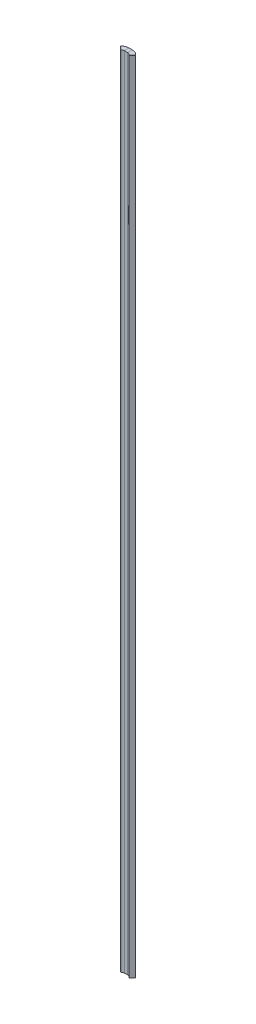
ISO-10303-21;
HEADER;
FILE_DESCRIPTION(('STEP AP214'),'2;1');
FILE_NAME('part.step','',(''),(''),'','','');
FILE_SCHEMA(('AUTOMOTIVE_DESIGN { 1 0 10303 214 1 1 1 1 }'));
ENDSEC;
DATA;
#1=APPLICATION_CONTEXT('core data for automotive mechanical design processes');
#2=APPLICATION_PROTOCOL_DEFINITION('international standard','automotive_design',2000,#1);
#3=PRODUCT_CONTEXT('',#1,'mechanical');
#4=PRODUCT('Part','Part','',(#3));
#5=PRODUCT_RELATED_PRODUCT_CATEGORY('part','',(#4));
#6=PRODUCT_DEFINITION_FORMATION('','',#4);
#7=PRODUCT_DEFINITION_CONTEXT('part definition',#1,'design');
#8=PRODUCT_DEFINITION('design','',#6,#7);
#9=PRODUCT_DEFINITION_SHAPE('','',#8);
#10=(LENGTH_UNIT() NAMED_UNIT(*) SI_UNIT(.MILLI.,.METRE.));
#11=(NAMED_UNIT(*) PLANE_ANGLE_UNIT() SI_UNIT($,.RADIAN.));
#12=(NAMED_UNIT(*) SI_UNIT($,.STERADIAN.) SOLID_ANGLE_UNIT());
#13=UNCERTAINTY_MEASURE_WITH_UNIT(LENGTH_MEASURE(1.E-05),#10,'distance_accuracy_value','');
#14=(GEOMETRIC_REPRESENTATION_CONTEXT(3) GLOBAL_UNCERTAINTY_ASSIGNED_CONTEXT((#13)) GLOBAL_UNIT_ASSIGNED_CONTEXT((#10,
#11,#12)) REPRESENTATION_CONTEXT('',''));
#15=CARTESIAN_POINT('',(0.,0.,0.));
#16=DIRECTION('',(0.,0.,1.));
#17=DIRECTION('',(1.,0.,0.));
#18=AXIS2_PLACEMENT_3D('',#15,#16,#17);
#19=CARTESIAN_POINT('',(-1.49999999999999,-85.,-1.));
#20=DIRECTION('',(0.,-1.,0.));
#21=DIRECTION('',(0.,0.,-1.));
#22=AXIS2_PLACEMENT_3D('',#19,#20,#21);
#23=PLANE('',#22);
#24=DIRECTION('',(1.,0.,0.));
#25=VECTOR('',#24,1.);
#26=CARTESIAN_POINT('',(-1.49999999999999,-85.,-1.));
#27=LINE('',#26,#25);
#28=CARTESIAN_POINT('',(-0.440508936019847,-85.,-1.));
#29=VERTEX_POINT('',#28);
#30=CARTESIAN_POINT('',(0.25802325223988,-84.9999999999999,-1.));
#31=VERTEX_POINT('',#30);
#32=EDGE_CURVE('E243',#29,#31,#27,.T.);
#33=ORIENTED_EDGE('',*,*,#32,.T.);
#34=DIRECTION('',(0.,0.,1.));
#35=VECTOR('',#34,1.);
#36=CARTESIAN_POINT('',(0.258023252239891,-85.,-1.));
#37=LINE('',#36,#35);
#38=CARTESIAN_POINT('',(0.258023252239891,-85.,0.));
#39=VERTEX_POINT('',#38);
#40=EDGE_CURVE('E14',#31,#39,#37,.T.);
#41=ORIENTED_EDGE('',*,*,#40,.T.);
#42=DIRECTION('',(1.,0.,0.));
#43=VECTOR('',#42,1.);
#44=CARTESIAN_POINT('',(-1.49999999999999,-85.,0.));
#45=LINE('',#44,#43);
#46=CARTESIAN_POINT('',(-0.440508936019847,-85.,0.));
#47=VERTEX_POINT('',#46);
#48=EDGE_CURVE('E260',#47,#39,#45,.T.);
#49=ORIENTED_EDGE('',*,*,#48,.F.);
#50=DIRECTION('',(0.,0.,1.));
#51=VECTOR('',#50,1.);
#52=CARTESIAN_POINT('',(-0.440508936019837,-85.,-1.));
#53=LINE('',#52,#51);
#54=EDGE_CURVE('E242',#29,#47,#53,.T.);
#55=ORIENTED_EDGE('',*,*,#54,.F.);
#56=EDGE_LOOP('',(#33,#41,#49,#55));
#57=FACE_BOUND('',#56,.T.);
#58=ADVANCED_FACE('F59',(#57),#23,.T.);
#59=CARTESIAN_POINT('',(-1.50000000000001,85.,-1.));
#60=DIRECTION('',(0.,1.,0.));
#61=DIRECTION('',(0.,0.,1.));
#62=AXIS2_PLACEMENT_3D('',#59,#60,#61);
#63=PLANE('',#62);
#64=DIRECTION('',(-1.,0.,0.));
#65=VECTOR('',#64,1.);
#66=CARTESIAN_POINT('',(-1.50000000000001,85.,0.));
#67=LINE('',#66,#65);
#68=CARTESIAN_POINT('',(0.258023252239872,85.,0.));
#69=VERTEX_POINT('',#68);
#70=CARTESIAN_POINT('',(-0.440508936019847,85.,0.));
#71=VERTEX_POINT('',#70);
#72=EDGE_CURVE('E83',#69,#71,#67,.T.);
#73=ORIENTED_EDGE('',*,*,#72,.F.);
#74=DIRECTION('',(0.,0.,-1.));
#75=VECTOR('',#74,1.);
#76=CARTESIAN_POINT('',(0.25802325223987,85.,-1.));
#77=LINE('',#76,#75);
#78=CARTESIAN_POINT('',(0.258023252239889,85.,-1.));
#79=VERTEX_POINT('',#78);
#80=EDGE_CURVE('E254',#69,#79,#77,.T.);
#81=ORIENTED_EDGE('',*,*,#80,.T.);
#82=DIRECTION('',(-1.,0.,0.));
#83=VECTOR('',#82,1.);
#84=CARTESIAN_POINT('',(-1.50000000000001,85.,-1.));
#85=LINE('',#84,#83);
#86=CARTESIAN_POINT('',(-0.440508936019847,85.,-1.));
#87=VERTEX_POINT('',#86);
#88=EDGE_CURVE('E62',#79,#87,#85,.T.);
#89=ORIENTED_EDGE('',*,*,#88,.T.);
#90=DIRECTION('',(0.,0.,-1.));
#91=VECTOR('',#90,1.);
#92=CARTESIAN_POINT('',(-0.440508936019857,85.,-1.));
#93=LINE('',#92,#91);
#94=EDGE_CURVE('E249',#71,#87,#93,.T.);
#95=ORIENTED_EDGE('',*,*,#94,.F.);
#96=EDGE_LOOP('',(#73,#81,#89,#95));
#97=FACE_BOUND('',#96,.T.);
#98=ADVANCED_FACE('F265',(#97),#63,.T.);
#99=CARTESIAN_POINT('',(0.,0.,0.));
#100=DIRECTION('',(0.,0.,1.));
#101=DIRECTION('',(1.,0.,0.));
#102=AXIS2_PLACEMENT_3D('',#99,#100,#101);
#103=PLANE('',#102);
#104=ORIENTED_EDGE('',*,*,#48,.T.);
#105=DIRECTION('',(0.,1.,0.));
#106=VECTOR('',#105,1.);
#107=CARTESIAN_POINT('',(0.258023252239881,0.,0.));
#108=LINE('',#107,#106);
#109=EDGE_CURVE('E67',#39,#69,#108,.T.);
#110=ORIENTED_EDGE('',*,*,#109,.T.);
#111=ORIENTED_EDGE('',*,*,#72,.T.);
#112=DIRECTION('',(0.,1.,0.));
#113=VECTOR('',#112,1.);
#114=CARTESIAN_POINT('',(-0.440508936019847,0.,0.));
#115=LINE('',#114,#113);
#116=EDGE_CURVE('E246',#47,#71,#115,.T.);
#117=ORIENTED_EDGE('',*,*,#116,.F.);
#118=EDGE_LOOP('',(#104,#110,#111,#117));
#119=FACE_BOUND('',#118,.T.);
#120=ADVANCED_FACE('F315',(#119),#103,.T.);
#121=CARTESIAN_POINT('',(0.,0.,-1.));
#122=DIRECTION('',(0.,0.,1.));
#123=DIRECTION('',(1.,0.,0.));
#124=AXIS2_PLACEMENT_3D('',#121,#122,#123);
#125=PLANE('',#124);
#126=DIRECTION('',(0.,1.,0.));
#127=VECTOR('',#126,1.);
#128=CARTESIAN_POINT('',(0.258023252239881,0.,-1.));
#129=LINE('',#128,#127);
#130=EDGE_CURVE('E252',#31,#79,#129,.T.);
#131=ORIENTED_EDGE('',*,*,#130,.F.);
#132=ORIENTED_EDGE('',*,*,#32,.F.);
#133=DIRECTION('',(0.,1.,0.));
#134=VECTOR('',#133,1.);
#135=CARTESIAN_POINT('',(-0.440508936019847,0.,-1.));
#136=LINE('',#135,#134);
#137=EDGE_CURVE('E240',#29,#87,#136,.T.);
#138=ORIENTED_EDGE('',*,*,#137,.T.);
#139=ORIENTED_EDGE('',*,*,#88,.F.);
#140=EDGE_LOOP('',(#131,#132,#138,#139));
#141=FACE_BOUND('',#140,.T.);
#142=ADVANCED_FACE('F317',(#141),#125,.F.);
#143=CARTESIAN_POINT('',(-0.440508936019836,-85.,0.7366));
#144=DIRECTION('',(0.,-1.,0.));
#145=DIRECTION('',(0.,0.,-1.));
#146=AXIS2_PLACEMENT_3D('',#143,#144,#145);
#147=PLANE('',#146);
#148=ORIENTED_EDGE('',*,*,#54,.T.);
#149=CARTESIAN_POINT('',(-0.440508936019836,-85.,0.7366));
#150=DIRECTION('',(0.,1.,0.));
#151=DIRECTION('',(-1.,0.,0.));
#152=AXIS2_PLACEMENT_3D('',#149,#150,#151);
#153=CIRCLE('',#152,0.7366);
#154=CARTESIAN_POINT('',(-0.961363791041846,-85.,0.215745144977997));
#155=VERTEX_POINT('',#154);
#156=EDGE_CURVE('E201',#47,#155,#153,.T.);
#157=ORIENTED_EDGE('',*,*,#156,.T.);
#158=DIRECTION('',(0.707106781186549,0.,0.707106781186546));
#159=VECTOR('',#158,1.);
#160=CARTESIAN_POINT('',(-1.66847057222839,-85.,-0.491361636208549));
#161=LINE('',#160,#159);
#162=CARTESIAN_POINT('',(-1.6684705722284,-85.,-0.491361636208542));
#163=VERTEX_POINT('',#162);
#164=EDGE_CURVE('E216',#163,#155,#161,.T.);
#165=ORIENTED_EDGE('',*,*,#164,.F.);
#166=CARTESIAN_POINT('',(-0.440508936019836,-85.,0.7366));
#167=DIRECTION('',(0.,1.,0.));
#168=DIRECTION('',(0.,0.,-1.));
#169=AXIS2_PLACEMENT_3D('',#166,#167,#168);
#170=CIRCLE('',#169,1.7366);
#171=EDGE_CURVE('E229',#29,#163,#170,.T.);
#172=ORIENTED_EDGE('',*,*,#171,.F.);
#173=EDGE_LOOP('',(#148,#157,#165,#172));
#174=FACE_BOUND('',#173,.T.);
#175=ADVANCED_FACE('F288',(#174),#147,.T.);
#176=CARTESIAN_POINT('',(-0.440508936019857,85.,0.7366));
#177=DIRECTION('',(0.,1.,0.));
#178=DIRECTION('',(0.,0.,1.));
#179=AXIS2_PLACEMENT_3D('',#176,#177,#178);
#180=PLANE('',#179);
#181=DIRECTION('',(-0.707106781186549,0.,-0.707106781186546));
#182=VECTOR('',#181,1.);
#183=CARTESIAN_POINT('',(-1.66847057222841,85.,-0.491361636208549));
#184=LINE('',#183,#182);
#185=CARTESIAN_POINT('',(-0.961363791041866,85.,0.215745144977997));
#186=VERTEX_POINT('',#185);
#187=CARTESIAN_POINT('',(-1.66847057222841,85.,-0.491361636208561));
#188=VERTEX_POINT('',#187);
#189=EDGE_CURVE('E204',#186,#188,#184,.T.);
#190=ORIENTED_EDGE('',*,*,#189,.F.);
#191=CARTESIAN_POINT('',(-0.440508936019857,85.,0.7366));
#192=DIRECTION('',(0.,1.,0.));
#193=DIRECTION('',(-1.,0.,0.));
#194=AXIS2_PLACEMENT_3D('',#191,#192,#193);
#195=CIRCLE('',#194,0.7366);
#196=EDGE_CURVE('E233',#186,#71,#195,.F.);
#197=ORIENTED_EDGE('',*,*,#196,.T.);
#198=ORIENTED_EDGE('',*,*,#94,.T.);
#199=CARTESIAN_POINT('',(-0.440508936019857,85.,0.7366));
#200=DIRECTION('',(0.,-1.,0.));
#201=DIRECTION('',(0.,0.,1.));
#202=AXIS2_PLACEMENT_3D('',#199,#200,#201);
#203=CIRCLE('',#202,1.7366);
#204=EDGE_CURVE('E232',#188,#87,#203,.T.);
#205=ORIENTED_EDGE('',*,*,#204,.F.);
#206=EDGE_LOOP('',(#190,#197,#198,#205));
#207=FACE_BOUND('',#206,.T.);
#208=ADVANCED_FACE('F271',(#207),#180,.T.);
#209=CARTESIAN_POINT('',(-0.440508936019826,-170.005715418136,0.7366));
#210=DIRECTION('',(0.,1.,0.));
#211=DIRECTION('',(-1.,0.,0.));
#212=AXIS2_PLACEMENT_3D('',#209,#210,#211);
#213=CYLINDRICAL_SURFACE('',#212,1.7366);
#214=ORIENTED_EDGE('',*,*,#204,.T.);
#215=ORIENTED_EDGE('',*,*,#137,.F.);
#216=ORIENTED_EDGE('',*,*,#171,.T.);
#217=DIRECTION('',(0.,1.,0.));
#218=VECTOR('',#217,1.);
#219=CARTESIAN_POINT('',(-1.6684705722284,0.,-0.491361636208549));
#220=LINE('',#219,#218);
#221=EDGE_CURVE('E194',#163,#188,#220,.T.);
#222=ORIENTED_EDGE('',*,*,#221,.T.);
#223=EDGE_LOOP('',(#214,#215,#216,#222));
#224=FACE_BOUND('',#223,.T.);
#225=ADVANCED_FACE('F275',(#224),#213,.T.);
#226=CARTESIAN_POINT('',(-0.440508936019826,-170.005715418136,0.7366));
#227=DIRECTION('',(0.,1.,0.));
#228=DIRECTION('',(-1.,0.,0.));
#229=AXIS2_PLACEMENT_3D('',#226,#227,#228);
#230=CYLINDRICAL_SURFACE('',#229,0.7366);
#231=ORIENTED_EDGE('',*,*,#196,.F.);
#232=DIRECTION('',(0.,1.,0.));
#233=VECTOR('',#232,1.);
#234=CARTESIAN_POINT('',(-0.961363791041856,0.,0.215745144977997));
#235=LINE('',#234,#233);
#236=EDGE_CURVE('E211',#155,#186,#235,.T.);
#237=ORIENTED_EDGE('',*,*,#236,.F.);
#238=ORIENTED_EDGE('',*,*,#156,.F.);
#239=ORIENTED_EDGE('',*,*,#116,.T.);
#240=EDGE_LOOP('',(#231,#237,#238,#239));
#241=FACE_BOUND('',#240,.T.);
#242=ADVANCED_FACE('F292',(#241),#230,.F.);
#243=CARTESIAN_POINT('',(-1.7308852580095,85.,-0.428946950427463));
#244=DIRECTION('',(-0.707106781186546,0.,0.707106781186549));
#245=DIRECTION('',(0.,-1.,0.));
#246=AXIS2_PLACEMENT_3D('',#243,#244,#245);
#247=PLANE('',#246);
#248=DIRECTION('',(0.,-1.,0.));
#249=VECTOR('',#248,1.);
#250=CARTESIAN_POINT('',(-1.02377847682295,85.,0.278159830759083));
#251=LINE('',#250,#249);
#252=CARTESIAN_POINT('',(-1.02377847682295,85.,0.278159830759083));
#253=VERTEX_POINT('',#252);
#254=CARTESIAN_POINT('',(-1.02377847682293,-85.,0.278159830759083));
#255=VERTEX_POINT('',#254);
#256=EDGE_CURVE('E206',#253,#255,#251,.T.);
#257=ORIENTED_EDGE('',*,*,#256,.F.);
#258=DIRECTION('',(0.707106781186549,0.,0.707106781186546));
#259=VECTOR('',#258,1.);
#260=CARTESIAN_POINT('',(-1.7308852580095,85.,-0.428946950427463));
#261=LINE('',#260,#259);
#262=CARTESIAN_POINT('',(-1.7308852580095,85.,-0.428946950427463));
#263=VERTEX_POINT('',#262);
#264=EDGE_CURVE('E198',#263,#253,#261,.T.);
#265=ORIENTED_EDGE('',*,*,#264,.F.);
#266=DIRECTION('',(0.,-1.,0.));
#267=VECTOR('',#266,1.);
#268=CARTESIAN_POINT('',(-1.7308852580095,85.,-0.428946950427463));
#269=LINE('',#268,#267);
#270=CARTESIAN_POINT('',(-1.73088525800948,-85.,-0.428946950427463));
#271=VERTEX_POINT('',#270);
#272=EDGE_CURVE('E224',#263,#271,#269,.T.);
#273=ORIENTED_EDGE('',*,*,#272,.T.);
#274=DIRECTION('',(0.707106781186549,0.,0.707106781186546));
#275=VECTOR('',#274,1.);
#276=CARTESIAN_POINT('',(-1.73088525800948,-85.,-0.428946950427463));
#277=LINE('',#276,#275);
#278=EDGE_CURVE('E222',#271,#255,#277,.T.);
#279=ORIENTED_EDGE('',*,*,#278,.T.);
#280=EDGE_LOOP('',(#257,#265,#273,#279));
#281=FACE_BOUND('',#280,.T.);
#282=ADVANCED_FACE('F300',(#281),#247,.T.);
#283=CARTESIAN_POINT('',(-0.670225086229671,0.,-1.48960712220729));
#284=DIRECTION('',(0.707106781186549,0.,0.707106781186546));
#285=DIRECTION('',(0.707106781186546,0.,-0.707106781186549));
#286=AXIS2_PLACEMENT_3D('',#283,#284,#285);
#287=PLANE('',#286);
#288=ORIENTED_EDGE('',*,*,#221,.F.);
#289=DIRECTION('',(0.707106781186546,0.,-0.707106781186549));
#290=VECTOR('',#289,1.);
#291=CARTESIAN_POINT('',(-1.73088525800948,-85.,-0.428946950427463));
#292=LINE('',#291,#290);
#293=EDGE_CURVE('E219',#271,#163,#292,.T.);
#294=ORIENTED_EDGE('',*,*,#293,.F.);
#295=ORIENTED_EDGE('',*,*,#272,.F.);
#296=DIRECTION('',(-0.707106781186546,0.,0.707106781186549));
#297=VECTOR('',#296,1.);
#298=CARTESIAN_POINT('',(-1.7308852580095,85.,-0.428946950427463));
#299=LINE('',#298,#297);
#300=EDGE_CURVE('E202',#188,#263,#299,.T.);
#301=ORIENTED_EDGE('',*,*,#300,.F.);
#302=EDGE_LOOP('',(#288,#294,#295,#301));
#303=FACE_BOUND('',#302,.T.);
#304=ADVANCED_FACE('F280',(#303),#287,.F.);
#305=CARTESIAN_POINT('',(-1.73088525800948,-85.,-0.428946950427463));
#306=DIRECTION('',(0.,-1.,0.));
#307=DIRECTION('',(-0.707106781186549,0.,-0.707106781186546));
#308=AXIS2_PLACEMENT_3D('',#305,#306,#307);
#309=PLANE('',#308);
#310=ORIENTED_EDGE('',*,*,#293,.T.);
#311=ORIENTED_EDGE('',*,*,#164,.T.);
#312=DIRECTION('',(0.707106781186546,0.,-0.707106781186549));
#313=VECTOR('',#312,1.);
#314=CARTESIAN_POINT('',(-1.02377847682293,-85.,0.278159830759083));
#315=LINE('',#314,#313);
#316=EDGE_CURVE('E214',#255,#155,#315,.T.);
#317=ORIENTED_EDGE('',*,*,#316,.F.);
#318=ORIENTED_EDGE('',*,*,#278,.F.);
#319=EDGE_LOOP('',(#310,#311,#317,#318));
#320=FACE_BOUND('',#319,.T.);
#321=ADVANCED_FACE('F284',(#320),#309,.T.);
#322=CARTESIAN_POINT('',(0.0368816949568782,0.,-0.78250034102074));
#323=DIRECTION('',(0.707106781186549,0.,0.707106781186546));
#324=DIRECTION('',(0.707106781186546,0.,-0.707106781186549));
#325=AXIS2_PLACEMENT_3D('',#322,#323,#324);
#326=PLANE('',#325);
#327=ORIENTED_EDGE('',*,*,#316,.T.);
#328=ORIENTED_EDGE('',*,*,#236,.T.);
#329=DIRECTION('',(-0.707106781186546,0.,0.707106781186549));
#330=VECTOR('',#329,1.);
#331=CARTESIAN_POINT('',(-1.02377847682295,85.,0.278159830759083));
#332=LINE('',#331,#330);
#333=EDGE_CURVE('E209',#186,#253,#332,.T.);
#334=ORIENTED_EDGE('',*,*,#333,.T.);
#335=ORIENTED_EDGE('',*,*,#256,.T.);
#336=EDGE_LOOP('',(#327,#328,#334,#335));
#337=FACE_BOUND('',#336,.T.);
#338=ADVANCED_FACE('F294',(#337),#326,.T.);
#339=CARTESIAN_POINT('',(-1.7308852580095,85.,-0.428946950427463));
#340=DIRECTION('',(0.,1.,0.));
#341=DIRECTION('',(0.707106781186549,0.,0.707106781186546));
#342=AXIS2_PLACEMENT_3D('',#339,#340,#341);
#343=PLANE('',#342);
#344=ORIENTED_EDGE('',*,*,#333,.F.);
#345=ORIENTED_EDGE('',*,*,#189,.T.);
#346=ORIENTED_EDGE('',*,*,#300,.T.);
#347=ORIENTED_EDGE('',*,*,#264,.T.);
#348=EDGE_LOOP('',(#344,#345,#346,#347));
#349=FACE_BOUND('',#348,.T.);
#350=ADVANCED_FACE('F296',(#349),#343,.T.);
#351=CARTESIAN_POINT('',(0.258023252239891,-84.9999999999999,0.7366));
#352=DIRECTION('',(0.,-1.,0.));
#353=DIRECTION('',(0.,0.,-1.));
#354=AXIS2_PLACEMENT_3D('',#351,#352,#353);
#355=PLANE('',#354);
#356=DIRECTION('',(-0.707106781186549,0.,0.707106781186546));
#357=VECTOR('',#356,1.);
#358=CARTESIAN_POINT('',(1.48598488844845,-85.,-0.491361636208556));
#359=LINE('',#358,#357);
#360=CARTESIAN_POINT('',(1.48598488844845,-85.,-0.491361636208556));
#361=VERTEX_POINT('',#360);
#362=CARTESIAN_POINT('',(0.778878107261896,-85.,0.215745144977983));
#363=VERTEX_POINT('',#362);
#364=EDGE_CURVE('E157',#361,#363,#359,.T.);
#365=ORIENTED_EDGE('',*,*,#364,.T.);
#366=CARTESIAN_POINT('',(0.258023252239891,-84.9999999999999,0.7366));
#367=DIRECTION('',(0.,-1.,0.));
#368=DIRECTION('',(1.,0.,0.));
#369=AXIS2_PLACEMENT_3D('',#366,#367,#368);
#370=CIRCLE('',#369,0.7366);
#371=EDGE_CURVE('E75',#363,#39,#370,.F.);
#372=ORIENTED_EDGE('',*,*,#371,.T.);
#373=ORIENTED_EDGE('',*,*,#40,.F.);
#374=CARTESIAN_POINT('',(0.258023252239891,-84.9999999999999,0.7366));
#375=DIRECTION('',(0.,1.,0.));
#376=DIRECTION('',(0.,0.,-1.));
#377=AXIS2_PLACEMENT_3D('',#374,#375,#376);
#378=CIRCLE('',#377,1.7366);
#379=EDGE_CURVE('E187',#361,#31,#378,.T.);
#380=ORIENTED_EDGE('',*,*,#379,.F.);
#381=EDGE_LOOP('',(#365,#372,#373,#380));
#382=FACE_BOUND('',#381,.T.);
#383=ADVANCED_FACE('F338',(#382),#355,.T.);
#384=CARTESIAN_POINT('',(0.25802325223987,85.,0.7366));
#385=DIRECTION('',(0.,1.,0.));
#386=DIRECTION('',(0.,0.,1.));
#387=AXIS2_PLACEMENT_3D('',#384,#385,#386);
#388=PLANE('',#387);
#389=ORIENTED_EDGE('',*,*,#80,.F.);
#390=CARTESIAN_POINT('',(0.25802325223987,85.,0.7366));
#391=DIRECTION('',(0.,-1.,0.));
#392=DIRECTION('',(1.,0.,0.));
#393=AXIS2_PLACEMENT_3D('',#390,#391,#392);
#394=CIRCLE('',#393,0.7366);
#395=CARTESIAN_POINT('',(0.77887810726189,85.,0.215745144977997));
#396=VERTEX_POINT('',#395);
#397=EDGE_CURVE('E191',#69,#396,#394,.T.);
#398=ORIENTED_EDGE('',*,*,#397,.T.);
#399=DIRECTION('',(0.707106781186549,0.,-0.707106781186546));
#400=VECTOR('',#399,1.);
#401=CARTESIAN_POINT('',(1.48598488844843,85.,-0.491361636208556));
#402=LINE('',#401,#400);
#403=CARTESIAN_POINT('',(1.48598488844844,85.,-0.491361636208552));
#404=VERTEX_POINT('',#403);
#405=EDGE_CURVE('E175',#396,#404,#402,.T.);
#406=ORIENTED_EDGE('',*,*,#405,.T.);
#407=CARTESIAN_POINT('',(0.25802325223987,85.,0.7366));
#408=DIRECTION('',(0.,-1.,0.));
#409=DIRECTION('',(0.,0.,1.));
#410=AXIS2_PLACEMENT_3D('',#407,#408,#409);
#411=CIRCLE('',#410,1.7366);
#412=EDGE_CURVE('E190',#79,#404,#411,.T.);
#413=ORIENTED_EDGE('',*,*,#412,.F.);
#414=EDGE_LOOP('',(#389,#398,#406,#413));
#415=FACE_BOUND('',#414,.T.);
#416=ADVANCED_FACE('F323',(#415),#388,.T.);
#417=CARTESIAN_POINT('',(0.25802325223986,170.005715418136,0.7366));
#418=DIRECTION('',(0.,-1.,0.));
#419=DIRECTION('',(1.,0.,0.));
#420=AXIS2_PLACEMENT_3D('',#417,#418,#419);
#421=CYLINDRICAL_SURFACE('',#420,1.7366);
#422=ORIENTED_EDGE('',*,*,#412,.T.);
#423=DIRECTION('',(0.,1.,0.));
#424=VECTOR('',#423,1.);
#425=CARTESIAN_POINT('',(1.48598488844844,0.,-0.491361636208556));
#426=LINE('',#425,#424);
#427=EDGE_CURVE('E177',#361,#404,#426,.T.);
#428=ORIENTED_EDGE('',*,*,#427,.F.);
#429=ORIENTED_EDGE('',*,*,#379,.T.);
#430=ORIENTED_EDGE('',*,*,#130,.T.);
#431=EDGE_LOOP('',(#422,#428,#429,#430));
#432=FACE_BOUND('',#431,.T.);
#433=ADVANCED_FACE('F320',(#432),#421,.T.);
#434=CARTESIAN_POINT('',(0.25802325223986,170.005715418136,0.7366));
#435=DIRECTION('',(0.,-1.,0.));
#436=DIRECTION('',(1.,0.,0.));
#437=AXIS2_PLACEMENT_3D('',#434,#435,#436);
#438=CYLINDRICAL_SURFACE('',#437,0.7366);
#439=ORIENTED_EDGE('',*,*,#397,.F.);
#440=ORIENTED_EDGE('',*,*,#109,.F.);
#441=ORIENTED_EDGE('',*,*,#371,.F.);
#442=DIRECTION('',(0.,1.,0.));
#443=VECTOR('',#442,1.);
#444=CARTESIAN_POINT('',(0.778878107261893,0.,0.21574514497799));
#445=LINE('',#444,#443);
#446=EDGE_CURVE('E180',#363,#396,#445,.T.);
#447=ORIENTED_EDGE('',*,*,#446,.T.);
#448=EDGE_LOOP('',(#439,#440,#441,#447));
#449=FACE_BOUND('',#448,.T.);
#450=ADVANCED_FACE('F339',(#449),#438,.F.);
#451=CARTESIAN_POINT('',(1.67743643869979,85.,-0.299910085957193));
#452=DIRECTION('',(0.707106781186546,0.,0.707106781186549));
#453=DIRECTION('',(0.,1.,0.));
#454=AXIS2_PLACEMENT_3D('',#451,#452,#453);
#455=PLANE('',#454);
#456=DIRECTION('',(0.,1.,0.));
#457=VECTOR('',#456,1.);
#458=CARTESIAN_POINT('',(0.970329657513245,85.,0.407196695229354));
#459=LINE('',#458,#457);
#460=CARTESIAN_POINT('',(0.970329657513266,-85.,0.407196695229354));
#461=VERTEX_POINT('',#460);
#462=CARTESIAN_POINT('',(0.970329657513245,85.,0.407196695229354));
#463=VERTEX_POINT('',#462);
#464=EDGE_CURVE('E169',#461,#463,#459,.T.);
#465=ORIENTED_EDGE('',*,*,#464,.F.);
#466=DIRECTION('',(-0.707106781186549,0.,0.707106781186546));
#467=VECTOR('',#466,1.);
#468=CARTESIAN_POINT('',(1.67743643869982,-85.,-0.299910085957193));
#469=LINE('',#468,#467);
#470=CARTESIAN_POINT('',(1.67743643869982,-85.,-0.299910085957193));
#471=VERTEX_POINT('',#470);
#472=EDGE_CURVE('E155',#471,#461,#469,.T.);
#473=ORIENTED_EDGE('',*,*,#472,.F.);
#474=DIRECTION('',(0.,1.,0.));
#475=VECTOR('',#474,1.);
#476=CARTESIAN_POINT('',(1.67743643869979,85.,-0.299910085957193));
#477=LINE('',#476,#475);
#478=CARTESIAN_POINT('',(1.67743643869979,85.,-0.299910085957193));
#479=VERTEX_POINT('',#478);
#480=EDGE_CURVE('E167',#471,#479,#477,.T.);
#481=ORIENTED_EDGE('',*,*,#480,.T.);
#482=DIRECTION('',(-0.707106781186549,0.,0.707106781186546));
#483=VECTOR('',#482,1.);
#484=CARTESIAN_POINT('',(1.67743643869979,85.,-0.299910085957193));
#485=LINE('',#484,#483);
#486=EDGE_CURVE('E174',#479,#463,#485,.T.);
#487=ORIENTED_EDGE('',*,*,#486,.T.);
#488=EDGE_LOOP('',(#465,#473,#481,#487));
#489=FACE_BOUND('',#488,.T.);
#490=ADVANCED_FACE('F166',(#489),#455,.T.);
#491=CARTESIAN_POINT('',(0.616776266919985,0.,-1.36057025773702));
#492=DIRECTION('',(-0.707106781186549,0.,0.707106781186546));
#493=DIRECTION('',(0.707106781186546,0.,0.707106781186549));
#494=AXIS2_PLACEMENT_3D('',#491,#492,#493);
#495=PLANE('',#494);
#496=DIRECTION('',(0.707106781186546,0.,0.707106781186549));
#497=VECTOR('',#496,1.);
#498=CARTESIAN_POINT('',(-0.443883904859824,-85.,-2.42123042951684));
#499=LINE('',#498,#497);
#500=EDGE_CURVE('E152',#361,#471,#499,.T.);
#501=ORIENTED_EDGE('',*,*,#500,.F.);
#502=ORIENTED_EDGE('',*,*,#427,.T.);
#503=DIRECTION('',(-0.707106781186546,0.,-0.707106781186549));
#504=VECTOR('',#503,1.);
#505=CARTESIAN_POINT('',(-0.443883904859845,85.,-2.42123042951684));
#506=LINE('',#505,#504);
#507=EDGE_CURVE('E173',#479,#404,#506,.T.);
#508=ORIENTED_EDGE('',*,*,#507,.F.);
#509=ORIENTED_EDGE('',*,*,#480,.F.);
#510=EDGE_LOOP('',(#501,#502,#508,#509));
#511=FACE_BOUND('',#510,.T.);
#512=ADVANCED_FACE('F172',(#511),#495,.F.);
#513=CARTESIAN_POINT('',(-0.443883904859845,85.,-2.42123042951684));
#514=DIRECTION('',(0.,1.,0.));
#515=DIRECTION('',(-0.707106781186549,0.,0.707106781186546));
#516=AXIS2_PLACEMENT_3D('',#513,#514,#515);
#517=PLANE('',#516);
#518=ORIENTED_EDGE('',*,*,#405,.F.);
#519=DIRECTION('',(-0.707106781186546,0.,-0.707106781186549));
#520=VECTOR('',#519,1.);
#521=CARTESIAN_POINT('',(-1.15099068604639,85.,-1.71412364833029));
#522=LINE('',#521,#520);
#523=EDGE_CURVE('E162',#463,#396,#522,.T.);
#524=ORIENTED_EDGE('',*,*,#523,.F.);
#525=ORIENTED_EDGE('',*,*,#486,.F.);
#526=ORIENTED_EDGE('',*,*,#507,.T.);
#527=EDGE_LOOP('',(#518,#524,#525,#526));
#528=FACE_BOUND('',#527,.T.);
#529=ADVANCED_FACE('F328',(#528),#517,.T.);
#530=CARTESIAN_POINT('',(-0.0903305142665636,0.,-0.653463476550469));
#531=DIRECTION('',(-0.707106781186549,0.,0.707106781186546));
#532=DIRECTION('',(0.707106781186546,0.,0.707106781186549));
#533=AXIS2_PLACEMENT_3D('',#530,#531,#532);
#534=PLANE('',#533);
#535=ORIENTED_EDGE('',*,*,#446,.F.);
#536=DIRECTION('',(0.707106781186546,0.,0.707106781186549));
#537=VECTOR('',#536,1.);
#538=CARTESIAN_POINT('',(-1.15099068604637,-85.,-1.71412364833029));
#539=LINE('',#538,#537);
#540=EDGE_CURVE('E329',#363,#461,#539,.T.);
#541=ORIENTED_EDGE('',*,*,#540,.T.);
#542=ORIENTED_EDGE('',*,*,#464,.T.);
#543=ORIENTED_EDGE('',*,*,#523,.T.);
#544=EDGE_LOOP('',(#535,#541,#542,#543));
#545=FACE_BOUND('',#544,.T.);
#546=ADVANCED_FACE('F336',(#545),#534,.T.);
#547=CARTESIAN_POINT('',(-0.443883904859824,-85.,-2.42123042951684));
#548=DIRECTION('',(0.,-1.,0.));
#549=DIRECTION('',(0.707106781186549,0.,-0.707106781186546));
#550=AXIS2_PLACEMENT_3D('',#547,#548,#549);
#551=PLANE('',#550);
#552=ORIENTED_EDGE('',*,*,#364,.F.);
#553=ORIENTED_EDGE('',*,*,#500,.T.);
#554=ORIENTED_EDGE('',*,*,#472,.T.);
#555=ORIENTED_EDGE('',*,*,#540,.F.);
#556=EDGE_LOOP('',(#552,#553,#554,#555));
#557=FACE_BOUND('',#556,.T.);
#558=ADVANCED_FACE('F154',(#557),#551,.T.);
#559=CLOSED_SHELL('',(#58,#98,#120,#142,#175,#208,#225,#242,#282,#304,#321,#338,#350,#383,#416,
#433,#450,#490,#512,#529,#546,#558));
#560=MANIFOLD_SOLID_BREP('B2',#559);
#561=ADVANCED_BREP_SHAPE_REPRESENTATION('',(#18,#560),#14);
#562=SHAPE_DEFINITION_REPRESENTATION(#9,#561);
ENDSEC;
END-ISO-10303-21;
